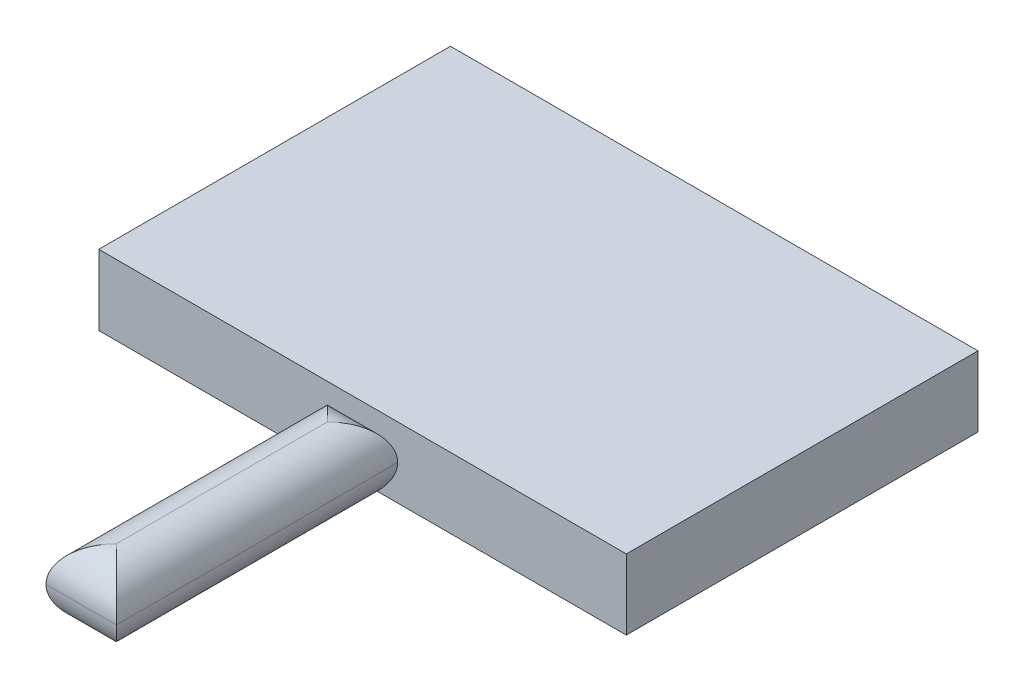
ISO-10303-21;
HEADER;
FILE_DESCRIPTION(('STEP AP214'),'2;1');
FILE_NAME('part.step','',(''),(''),'','','');
FILE_SCHEMA(('AUTOMOTIVE_DESIGN { 1 0 10303 214 1 1 1 1 }'));
ENDSEC;
DATA;
#1=APPLICATION_CONTEXT('core data for automotive mechanical design processes');
#2=APPLICATION_PROTOCOL_DEFINITION('international standard','automotive_design',2000,#1);
#3=PRODUCT_CONTEXT('',#1,'mechanical');
#4=PRODUCT('Part','Part','',(#3));
#5=PRODUCT_RELATED_PRODUCT_CATEGORY('part','',(#4));
#6=PRODUCT_DEFINITION_FORMATION('','',#4);
#7=PRODUCT_DEFINITION_CONTEXT('part definition',#1,'design');
#8=PRODUCT_DEFINITION('design','',#6,#7);
#9=PRODUCT_DEFINITION_SHAPE('','',#8);
#10=(LENGTH_UNIT() NAMED_UNIT(*) SI_UNIT(.MILLI.,.METRE.));
#11=(NAMED_UNIT(*) PLANE_ANGLE_UNIT() SI_UNIT($,.RADIAN.));
#12=(NAMED_UNIT(*) SI_UNIT($,.STERADIAN.) SOLID_ANGLE_UNIT());
#13=UNCERTAINTY_MEASURE_WITH_UNIT(LENGTH_MEASURE(1.E-05),#10,'distance_accuracy_value','');
#14=(GEOMETRIC_REPRESENTATION_CONTEXT(3) GLOBAL_UNCERTAINTY_ASSIGNED_CONTEXT((#13)) GLOBAL_UNIT_ASSIGNED_CONTEXT((#10,
#11,#12)) REPRESENTATION_CONTEXT('',''));
#15=CARTESIAN_POINT('',(0.,0.,0.));
#16=DIRECTION('',(0.,0.,1.));
#17=DIRECTION('',(1.,0.,0.));
#18=AXIS2_PLACEMENT_3D('',#15,#16,#17);
#19=CARTESIAN_POINT('',(8.5,2.,0.));
#20=DIRECTION('',(0.,0.,1.));
#21=DIRECTION('',(1.,0.,0.));
#22=AXIS2_PLACEMENT_3D('',#19,#20,#21);
#23=PLANE('',#22);
#24=DIRECTION('',(1.,0.,0.));
#25=VECTOR('',#24,1.);
#26=CARTESIAN_POINT('',(0.,2.,0.));
#27=LINE('',#26,#25);
#28=CARTESIAN_POINT('',(0.,2.,0.));
#29=VERTEX_POINT('',#28);
#30=CARTESIAN_POINT('',(15.,2.,0.));
#31=VERTEX_POINT('',#30);
#32=EDGE_CURVE('E58',#29,#31,#27,.T.);
#33=ORIENTED_EDGE('',*,*,#32,.F.);
#34=DIRECTION('',(0.,-1.,0.));
#35=VECTOR('',#34,1.);
#36=CARTESIAN_POINT('',(0.,2.,0.));
#37=LINE('',#36,#35);
#38=CARTESIAN_POINT('',(0.,0.,0.));
#39=VERTEX_POINT('',#38);
#40=EDGE_CURVE('E110',#29,#39,#37,.T.);
#41=ORIENTED_EDGE('',*,*,#40,.T.);
#42=DIRECTION('',(1.,0.,0.));
#43=VECTOR('',#42,1.);
#44=CARTESIAN_POINT('',(0.,0.,0.));
#45=LINE('',#44,#43);
#46=CARTESIAN_POINT('',(15.,0.,0.));
#47=VERTEX_POINT('',#46);
#48=EDGE_CURVE('E13',#39,#47,#45,.T.);
#49=ORIENTED_EDGE('',*,*,#48,.T.);
#50=DIRECTION('',(0.,-1.,0.));
#51=VECTOR('',#50,1.);
#52=CARTESIAN_POINT('',(15.,2.,0.));
#53=LINE('',#52,#51);
#54=EDGE_CURVE('E134',#31,#47,#53,.T.);
#55=ORIENTED_EDGE('',*,*,#54,.F.);
#56=EDGE_LOOP('',(#33,#41,#49,#55));
#57=FACE_BOUND('',#56,.T.);
#58=ADVANCED_FACE('F54',(#57),#23,.T.);
#59=CARTESIAN_POINT('',(0.,2.,0.));
#60=DIRECTION('',(0.,1.,0.));
#61=DIRECTION('',(0.,0.,1.));
#62=AXIS2_PLACEMENT_3D('',#59,#60,#61);
#63=PLANE('',#62);
#64=DIRECTION('',(0.,0.,-1.));
#65=VECTOR('',#64,1.);
#66=CARTESIAN_POINT('',(0.,2.,0.));
#67=LINE('',#66,#65);
#68=CARTESIAN_POINT('',(0.,2.,-10.));
#69=VERTEX_POINT('',#68);
#70=EDGE_CURVE('E106',#29,#69,#67,.T.);
#71=ORIENTED_EDGE('',*,*,#70,.F.);
#72=ORIENTED_EDGE('',*,*,#32,.T.);
#73=DIRECTION('',(0.,0.,-1.));
#74=VECTOR('',#73,1.);
#75=CARTESIAN_POINT('',(15.,2.,0.));
#76=LINE('',#75,#74);
#77=CARTESIAN_POINT('',(15.,2.,-10.));
#78=VERTEX_POINT('',#77);
#79=EDGE_CURVE('E90',#31,#78,#76,.T.);
#80=ORIENTED_EDGE('',*,*,#79,.T.);
#81=DIRECTION('',(1.,0.,0.));
#82=VECTOR('',#81,1.);
#83=CARTESIAN_POINT('',(0.,2.,-10.));
#84=LINE('',#83,#82);
#85=EDGE_CURVE('E128',#69,#78,#84,.T.);
#86=ORIENTED_EDGE('',*,*,#85,.F.);
#87=EDGE_LOOP('',(#71,#72,#80,#86));
#88=FACE_BOUND('',#87,.T.);
#89=ADVANCED_FACE('F140',(#88),#63,.T.);
#90=CARTESIAN_POINT('',(0.,0.,0.));
#91=DIRECTION('',(0.,1.,0.));
#92=DIRECTION('',(0.,0.,1.));
#93=AXIS2_PLACEMENT_3D('',#90,#91,#92);
#94=PLANE('',#93);
#95=ORIENTED_EDGE('',*,*,#48,.F.);
#96=DIRECTION('',(0.,0.,-1.));
#97=VECTOR('',#96,1.);
#98=CARTESIAN_POINT('',(0.,0.,0.));
#99=LINE('',#98,#97);
#100=CARTESIAN_POINT('',(0.,0.,-10.));
#101=VERTEX_POINT('',#100);
#102=EDGE_CURVE('E105',#39,#101,#99,.T.);
#103=ORIENTED_EDGE('',*,*,#102,.T.);
#104=DIRECTION('',(1.,0.,0.));
#105=VECTOR('',#104,1.);
#106=CARTESIAN_POINT('',(0.,0.,-10.));
#107=LINE('',#106,#105);
#108=CARTESIAN_POINT('',(15.,0.,-10.));
#109=VERTEX_POINT('',#108);
#110=EDGE_CURVE('E114',#101,#109,#107,.T.);
#111=ORIENTED_EDGE('',*,*,#110,.T.);
#112=DIRECTION('',(0.,0.,-1.));
#113=VECTOR('',#112,1.);
#114=CARTESIAN_POINT('',(15.,0.,0.));
#115=LINE('',#114,#113);
#116=EDGE_CURVE('E65',#47,#109,#115,.T.);
#117=ORIENTED_EDGE('',*,*,#116,.F.);
#118=EDGE_LOOP('',(#95,#103,#111,#117));
#119=FACE_BOUND('',#118,.T.);
#120=ADVANCED_FACE('F56',(#119),#94,.F.);
#121=CARTESIAN_POINT('',(15.,2.,0.));
#122=DIRECTION('',(-1.,0.,0.));
#123=DIRECTION('',(0.,0.,1.));
#124=AXIS2_PLACEMENT_3D('',#121,#122,#123);
#125=PLANE('',#124);
#126=ORIENTED_EDGE('',*,*,#116,.T.);
#127=DIRECTION('',(0.,-1.,0.));
#128=VECTOR('',#127,1.);
#129=CARTESIAN_POINT('',(15.,2.,-10.));
#130=LINE('',#129,#128);
#131=EDGE_CURVE('E111',#78,#109,#130,.T.);
#132=ORIENTED_EDGE('',*,*,#131,.F.);
#133=ORIENTED_EDGE('',*,*,#79,.F.);
#134=ORIENTED_EDGE('',*,*,#54,.T.);
#135=EDGE_LOOP('',(#126,#132,#133,#134));
#136=FACE_BOUND('',#135,.T.);
#137=ADVANCED_FACE('F139',(#136),#125,.F.);
#138=CARTESIAN_POINT('',(0.,2.,-10.));
#139=DIRECTION('',(0.,0.,-1.));
#140=DIRECTION('',(-1.,0.,0.));
#141=AXIS2_PLACEMENT_3D('',#138,#139,#140);
#142=PLANE('',#141);
#143=ORIENTED_EDGE('',*,*,#110,.F.);
#144=DIRECTION('',(0.,-1.,0.));
#145=VECTOR('',#144,1.);
#146=CARTESIAN_POINT('',(0.,2.,-10.));
#147=LINE('',#146,#145);
#148=EDGE_CURVE('E101',#69,#101,#147,.T.);
#149=ORIENTED_EDGE('',*,*,#148,.F.);
#150=ORIENTED_EDGE('',*,*,#85,.T.);
#151=ORIENTED_EDGE('',*,*,#131,.T.);
#152=EDGE_LOOP('',(#143,#149,#150,#151));
#153=FACE_BOUND('',#152,.T.);
#154=ADVANCED_FACE('F115',(#153),#142,.T.);
#155=CARTESIAN_POINT('',(0.,2.,0.));
#156=DIRECTION('',(-1.,0.,0.));
#157=DIRECTION('',(0.,0.,1.));
#158=AXIS2_PLACEMENT_3D('',#155,#156,#157);
#159=PLANE('',#158);
#160=ORIENTED_EDGE('',*,*,#102,.F.);
#161=ORIENTED_EDGE('',*,*,#40,.F.);
#162=ORIENTED_EDGE('',*,*,#70,.T.);
#163=ORIENTED_EDGE('',*,*,#148,.T.);
#164=EDGE_LOOP('',(#160,#161,#162,#163));
#165=FACE_BOUND('',#164,.T.);
#166=ADVANCED_FACE('F103',(#165),#159,.T.);
#167=CLOSED_SHELL('',(#58,#89,#120,#137,#154,#166));
#168=MANIFOLD_SOLID_BREP('B2',#167);
#169=CARTESIAN_POINT('',(8.5,1.,0.999999999999999));
#170=DIRECTION('',(-1.,0.,0.));
#171=DIRECTION('',(0.,0.,1.));
#172=AXIS2_PLACEMENT_3D('',#169,#170,#171);
#173=CYLINDRICAL_SURFACE('',#172,1.);
#174=CARTESIAN_POINT('',(7.5,1.,0.999999999999999));
#175=DIRECTION('',(-0.707106781186547,0.,0.707106781186548));
#176=DIRECTION('',(-0.707106781186548,0.,-0.707106781186547));
#177=AXIS2_PLACEMENT_3D('',#174,#175,#176);
#178=ELLIPSE('',#177,1.41421356237309,1.);
#179=CARTESIAN_POINT('',(7.5,2.,0.999999999999999));
#180=VERTEX_POINT('',#179);
#181=CARTESIAN_POINT('',(6.5,1.,0.));
#182=VERTEX_POINT('',#181);
#183=EDGE_CURVE('E52',#180,#182,#178,.T.);
#184=ORIENTED_EDGE('',*,*,#183,.F.);
#185=CARTESIAN_POINT('',(7.5,1.,0.999999999999999));
#186=DIRECTION('',(-0.707106781186548,0.,-0.707106781186547));
#187=DIRECTION('',(-0.707106781186547,0.,0.707106781186548));
#188=AXIS2_PLACEMENT_3D('',#185,#186,#187);
#189=ELLIPSE('',#188,1.41421356237309,1.);
#190=CARTESIAN_POINT('',(8.5,1.,0.));
#191=VERTEX_POINT('',#190);
#192=EDGE_CURVE('E279',#191,#180,#189,.F.);
#193=ORIENTED_EDGE('',*,*,#192,.F.);
#194=DIRECTION('',(1.,0.,0.));
#195=VECTOR('',#194,1.);
#196=CARTESIAN_POINT('',(8.5,1.,0.));
#197=LINE('',#196,#195);
#198=EDGE_CURVE('E276',#182,#191,#197,.T.);
#199=ORIENTED_EDGE('',*,*,#198,.F.);
#200=EDGE_LOOP('',(#184,#193,#199));
#201=FACE_BOUND('',#200,.T.);
#202=ADVANCED_FACE('F199',(#201),#173,.T.);
#203=CARTESIAN_POINT('',(7.5,1.,0.));
#204=DIRECTION('',(0.,0.,-1.));
#205=DIRECTION('',(-1.,0.,0.));
#206=AXIS2_PLACEMENT_3D('',#203,#204,#205);
#207=CYLINDRICAL_SURFACE('',#206,1.);
#208=DIRECTION('',(0.,0.,1.));
#209=VECTOR('',#208,1.);
#210=CARTESIAN_POINT('',(7.5,2.,8.));
#211=LINE('',#210,#209);
#212=CARTESIAN_POINT('',(7.5,2.,7.));
#213=VERTEX_POINT('',#212);
#214=EDGE_CURVE('E206',#180,#213,#211,.T.);
#215=ORIENTED_EDGE('',*,*,#214,.F.);
#216=ORIENTED_EDGE('',*,*,#183,.T.);
#217=DIRECTION('',(0.,0.,1.));
#218=VECTOR('',#217,1.);
#219=CARTESIAN_POINT('',(6.5,1.,0.));
#220=LINE('',#219,#218);
#221=CARTESIAN_POINT('',(6.5,1.,8.));
#222=VERTEX_POINT('',#221);
#223=EDGE_CURVE('E271',#222,#182,#220,.F.);
#224=ORIENTED_EDGE('',*,*,#223,.F.);
#225=CARTESIAN_POINT('',(7.5,1.,7.));
#226=DIRECTION('',(-0.707106781186547,0.,-0.707106781186547));
#227=DIRECTION('',(0.707106781186547,0.,-0.707106781186547));
#228=AXIS2_PLACEMENT_3D('',#225,#226,#227);
#229=ELLIPSE('',#228,1.41421356237309,1.);
#230=EDGE_CURVE('E244',#213,#222,#229,.F.);
#231=ORIENTED_EDGE('',*,*,#230,.F.);
#232=EDGE_LOOP('',(#215,#216,#224,#231));
#233=FACE_BOUND('',#232,.T.);
#234=ADVANCED_FACE('F285',(#233),#207,.T.);
#235=CARTESIAN_POINT('',(7.5,1.,0.));
#236=DIRECTION('',(0.,0.,1.));
#237=DIRECTION('',(1.,0.,0.));
#238=AXIS2_PLACEMENT_3D('',#235,#236,#237);
#239=CYLINDRICAL_SURFACE('',#238,1.);
#240=ORIENTED_EDGE('',*,*,#192,.T.);
#241=ORIENTED_EDGE('',*,*,#214,.T.);
#242=CARTESIAN_POINT('',(7.5,1.,7.));
#243=DIRECTION('',(-0.707106781186547,0.,0.707106781186548));
#244=DIRECTION('',(-0.707106781186548,0.,-0.707106781186547));
#245=AXIS2_PLACEMENT_3D('',#242,#243,#244);
#246=ELLIPSE('',#245,1.4142135623731,1.);
#247=CARTESIAN_POINT('',(8.5,1.,8.));
#248=VERTEX_POINT('',#247);
#249=EDGE_CURVE('E234',#248,#213,#246,.T.);
#250=ORIENTED_EDGE('',*,*,#249,.F.);
#251=DIRECTION('',(0.,0.,-1.));
#252=VECTOR('',#251,1.);
#253=CARTESIAN_POINT('',(8.5,1.,8.));
#254=LINE('',#253,#252);
#255=EDGE_CURVE('E238',#191,#248,#254,.F.);
#256=ORIENTED_EDGE('',*,*,#255,.F.);
#257=EDGE_LOOP('',(#240,#241,#250,#256));
#258=FACE_BOUND('',#257,.T.);
#259=ADVANCED_FACE('F237',(#258),#239,.T.);
#260=CARTESIAN_POINT('',(0.,1.,1.));
#261=DIRECTION('',(1.,0.,0.));
#262=DIRECTION('',(0.,0.,-1.));
#263=AXIS2_PLACEMENT_3D('',#260,#261,#262);
#264=CYLINDRICAL_SURFACE('',#263,1.);
#265=CARTESIAN_POINT('',(7.5,1.,0.999999999999999));
#266=DIRECTION('',(-0.707106781186547,0.,0.707106781186548));
#267=DIRECTION('',(0.707106781186548,0.,0.707106781186547));
#268=AXIS2_PLACEMENT_3D('',#265,#266,#267);
#269=ELLIPSE('',#268,1.41421356237309,1.);
#270=CARTESIAN_POINT('',(7.5,0.,0.999999999999999));
#271=VERTEX_POINT('',#270);
#272=EDGE_CURVE('E274',#182,#271,#269,.T.);
#273=ORIENTED_EDGE('',*,*,#272,.F.);
#274=ORIENTED_EDGE('',*,*,#198,.T.);
#275=CARTESIAN_POINT('',(7.5,1.,0.999999999999999));
#276=DIRECTION('',(0.707106781186548,0.,0.707106781186547));
#277=DIRECTION('',(0.707106781186547,0.,-0.707106781186548));
#278=AXIS2_PLACEMENT_3D('',#275,#276,#277);
#279=ELLIPSE('',#278,1.41421356237309,1.);
#280=EDGE_CURVE('E253',#271,#191,#279,.T.);
#281=ORIENTED_EDGE('',*,*,#280,.F.);
#282=EDGE_LOOP('',(#273,#274,#281));
#283=FACE_BOUND('',#282,.T.);
#284=ADVANCED_FACE('F282',(#283),#264,.T.);
#285=CARTESIAN_POINT('',(7.5,1.,0.));
#286=DIRECTION('',(0.,0.,1.));
#287=DIRECTION('',(1.,0.,0.));
#288=AXIS2_PLACEMENT_3D('',#285,#286,#287);
#289=CYLINDRICAL_SURFACE('',#288,1.);
#290=ORIENTED_EDGE('',*,*,#223,.T.);
#291=ORIENTED_EDGE('',*,*,#272,.T.);
#292=DIRECTION('',(0.,0.,1.));
#293=VECTOR('',#292,1.);
#294=CARTESIAN_POINT('',(7.5,0.,0.));
#295=LINE('',#294,#293);
#296=CARTESIAN_POINT('',(7.5,0.,7.));
#297=VERTEX_POINT('',#296);
#298=EDGE_CURVE('E267',#297,#271,#295,.F.);
#299=ORIENTED_EDGE('',*,*,#298,.F.);
#300=CARTESIAN_POINT('',(7.5,1.,7.));
#301=DIRECTION('',(0.707106781186547,0.,0.707106781186547));
#302=DIRECTION('',(-0.707106781186547,0.,0.707106781186547));
#303=AXIS2_PLACEMENT_3D('',#300,#301,#302);
#304=ELLIPSE('',#303,1.41421356237309,1.);
#305=EDGE_CURVE('E261',#222,#297,#304,.T.);
#306=ORIENTED_EDGE('',*,*,#305,.F.);
#307=EDGE_LOOP('',(#290,#291,#299,#306));
#308=FACE_BOUND('',#307,.T.);
#309=ADVANCED_FACE('F284',(#308),#289,.T.);
#310=CARTESIAN_POINT('',(0.,1.,7.));
#311=DIRECTION('',(-1.,0.,0.));
#312=DIRECTION('',(0.,0.,1.));
#313=AXIS2_PLACEMENT_3D('',#310,#311,#312);
#314=CYLINDRICAL_SURFACE('',#313,1.);
#315=ORIENTED_EDGE('',*,*,#249,.T.);
#316=ORIENTED_EDGE('',*,*,#230,.T.);
#317=DIRECTION('',(1.,0.,0.));
#318=VECTOR('',#317,1.);
#319=CARTESIAN_POINT('',(6.5,1.,8.));
#320=LINE('',#319,#318);
#321=EDGE_CURVE('E256',#248,#222,#320,.F.);
#322=ORIENTED_EDGE('',*,*,#321,.F.);
#323=EDGE_LOOP('',(#315,#316,#322));
#324=FACE_BOUND('',#323,.T.);
#325=ADVANCED_FACE('F257',(#324),#314,.T.);
#326=CARTESIAN_POINT('',(7.5,1.,0.));
#327=DIRECTION('',(0.,0.,-1.));
#328=DIRECTION('',(-1.,0.,0.));
#329=AXIS2_PLACEMENT_3D('',#326,#327,#328);
#330=CYLINDRICAL_SURFACE('',#329,1.);
#331=ORIENTED_EDGE('',*,*,#280,.T.);
#332=ORIENTED_EDGE('',*,*,#255,.T.);
#333=CARTESIAN_POINT('',(7.5,1.,7.));
#334=DIRECTION('',(0.707106781186547,0.,-0.707106781186548));
#335=DIRECTION('',(-0.707106781186548,0.,-0.707106781186547));
#336=AXIS2_PLACEMENT_3D('',#333,#334,#335);
#337=ELLIPSE('',#336,1.4142135623731,1.);
#338=EDGE_CURVE('E251',#297,#248,#337,.F.);
#339=ORIENTED_EDGE('',*,*,#338,.F.);
#340=ORIENTED_EDGE('',*,*,#298,.T.);
#341=EDGE_LOOP('',(#331,#332,#339,#340));
#342=FACE_BOUND('',#341,.T.);
#343=ADVANCED_FACE('F248',(#342),#330,.T.);
#344=CARTESIAN_POINT('',(0.,1.,7.));
#345=DIRECTION('',(1.,0.,0.));
#346=DIRECTION('',(0.,0.,-1.));
#347=AXIS2_PLACEMENT_3D('',#344,#345,#346);
#348=CYLINDRICAL_SURFACE('',#347,1.);
#349=ORIENTED_EDGE('',*,*,#321,.T.);
#350=ORIENTED_EDGE('',*,*,#305,.T.);
#351=ORIENTED_EDGE('',*,*,#338,.T.);
#352=EDGE_LOOP('',(#349,#350,#351));
#353=FACE_BOUND('',#352,.T.);
#354=ADVANCED_FACE('F263',(#353),#348,.T.);
#355=CLOSED_SHELL('',(#202,#234,#259,#284,#309,#325,#343,#354));
#356=MANIFOLD_SOLID_BREP('B7',#355);
#357=ADVANCED_BREP_SHAPE_REPRESENTATION('',(#18,#168,#356),#14);
#358=SHAPE_DEFINITION_REPRESENTATION(#9,#357);
ENDSEC;
END-ISO-10303-21;
